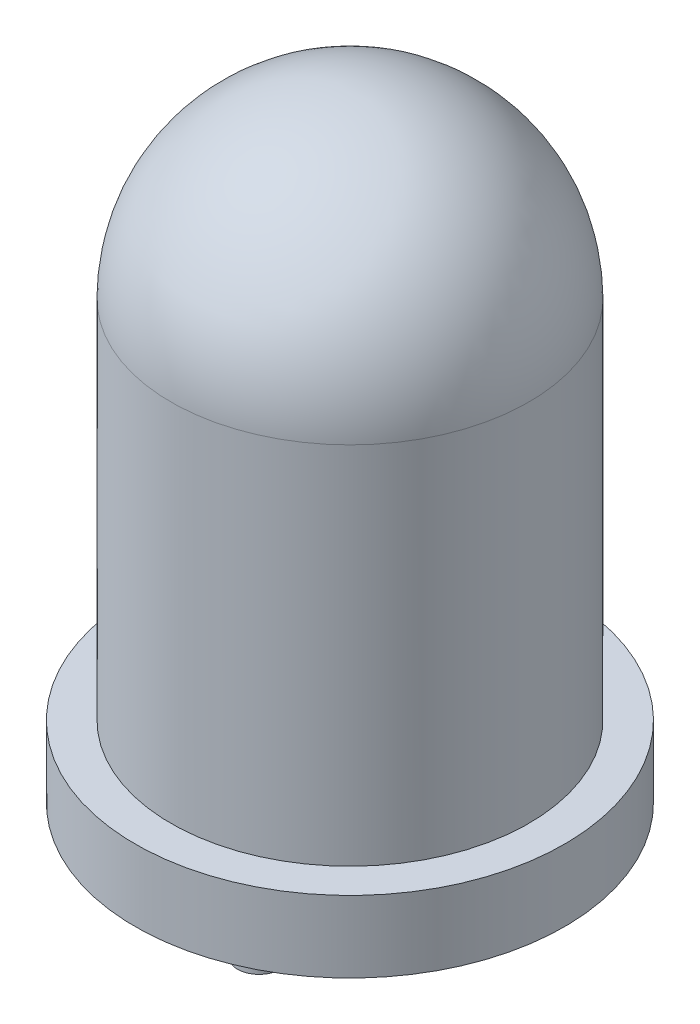
ISO-10303-21;
HEADER;
FILE_DESCRIPTION(('STEP AP214'),'2;1');
FILE_NAME('part.step','',(''),(''),'','','');
FILE_SCHEMA(('AUTOMOTIVE_DESIGN { 1 0 10303 214 1 1 1 1 }'));
ENDSEC;
DATA;
#1=APPLICATION_CONTEXT('core data for automotive mechanical design processes');
#2=APPLICATION_PROTOCOL_DEFINITION('international standard','automotive_design',2000,#1);
#3=PRODUCT_CONTEXT('',#1,'mechanical');
#4=PRODUCT('Part','Part','',(#3));
#5=PRODUCT_RELATED_PRODUCT_CATEGORY('part','',(#4));
#6=PRODUCT_DEFINITION_FORMATION('','',#4);
#7=PRODUCT_DEFINITION_CONTEXT('part definition',#1,'design');
#8=PRODUCT_DEFINITION('design','',#6,#7);
#9=PRODUCT_DEFINITION_SHAPE('','',#8);
#10=(LENGTH_UNIT() NAMED_UNIT(*) SI_UNIT(.MILLI.,.METRE.));
#11=(NAMED_UNIT(*) PLANE_ANGLE_UNIT() SI_UNIT($,.RADIAN.));
#12=(NAMED_UNIT(*) SI_UNIT($,.STERADIAN.) SOLID_ANGLE_UNIT());
#13=UNCERTAINTY_MEASURE_WITH_UNIT(LENGTH_MEASURE(1.E-05),#10,'distance_accuracy_value','');
#14=(GEOMETRIC_REPRESENTATION_CONTEXT(3) GLOBAL_UNCERTAINTY_ASSIGNED_CONTEXT((#13)) GLOBAL_UNIT_ASSIGNED_CONTEXT((#10,
#11,#12)) REPRESENTATION_CONTEXT('',''));
#15=CARTESIAN_POINT('',(0.,0.,0.));
#16=DIRECTION('',(0.,0.,1.));
#17=DIRECTION('',(1.,0.,0.));
#18=AXIS2_PLACEMENT_3D('',#15,#16,#17);
#19=CARTESIAN_POINT('',(-3.,0.,0.));
#20=DIRECTION('',(0.,1.,0.));
#21=DIRECTION('',(0.,0.,1.));
#22=AXIS2_PLACEMENT_3D('',#19,#20,#21);
#23=PLANE('',#22);
#24=CARTESIAN_POINT('',(1.27,0.,0.));
#25=DIRECTION('',(0.,1.,0.));
#26=DIRECTION('',(0.,0.,1.));
#27=AXIS2_PLACEMENT_3D('',#24,#25,#26);
#28=CIRCLE('',#27,0.3);
#29=CARTESIAN_POINT('',(1.27,0.,0.3));
#30=VERTEX_POINT('',#29);
#31=EDGE_CURVE('E303',#30,#30,#28,.F.);
#32=ORIENTED_EDGE('',*,*,#31,.F.);
#33=EDGE_LOOP('',(#32));
#34=FACE_BOUND('',#33,.T.);
#35=CARTESIAN_POINT('',(-1.27,0.,0.));
#36=DIRECTION('',(0.,1.,0.));
#37=DIRECTION('',(0.,0.,1.));
#38=AXIS2_PLACEMENT_3D('',#35,#36,#37);
#39=CIRCLE('',#38,0.3);
#40=CARTESIAN_POINT('',(-1.27,0.,0.3));
#41=VERTEX_POINT('',#40);
#42=EDGE_CURVE('E300',#41,#41,#39,.F.);
#43=ORIENTED_EDGE('',*,*,#42,.F.);
#44=EDGE_LOOP('',(#43));
#45=FACE_BOUND('',#44,.T.);
#46=CARTESIAN_POINT('',(0.,0.,0.));
#47=DIRECTION('',(0.,-1.,0.));
#48=DIRECTION('',(0.,0.,-1.));
#49=AXIS2_PLACEMENT_3D('',#46,#47,#48);
#50=CIRCLE('',#49,3.);
#51=CARTESIAN_POINT('',(0.,0.,-3.));
#52=VERTEX_POINT('',#51);
#53=EDGE_CURVE('E282',#52,#52,#50,.T.);
#54=ORIENTED_EDGE('',*,*,#53,.T.);
#55=EDGE_LOOP('',(#54));
#56=FACE_BOUND('',#55,.T.);
#57=ADVANCED_FACE('F38',(#34,#45,#56),#23,.F.);
#58=CARTESIAN_POINT('',(0.,6.1,0.));
#59=DIRECTION('',(0.,-1.,0.));
#60=DIRECTION('',(-1.,0.,0.));
#61=AXIS2_PLACEMENT_3D('',#58,#59,#60);
#62=SPHERICAL_SURFACE('',#61,2.5);
#63=CARTESIAN_POINT('',(0.,6.1,0.));
#64=DIRECTION('',(0.,-1.,0.));
#65=DIRECTION('',(0.,0.,-1.));
#66=AXIS2_PLACEMENT_3D('',#63,#64,#65);
#67=CIRCLE('',#66,2.5);
#68=CARTESIAN_POINT('',(0.,6.1,-2.5));
#69=VERTEX_POINT('',#68);
#70=EDGE_CURVE('E291',#69,#69,#67,.T.);
#71=ORIENTED_EDGE('',*,*,#70,.F.);
#72=EDGE_LOOP('',(#71));
#73=FACE_BOUND('',#72,.T.);
#74=ADVANCED_FACE('F382',(#73),#62,.T.);
#75=CARTESIAN_POINT('',(0.,0.,0.));
#76=DIRECTION('',(0.,-1.,0.));
#77=DIRECTION('',(0.,0.,-1.));
#78=AXIS2_PLACEMENT_3D('',#75,#76,#77);
#79=CYLINDRICAL_SURFACE('',#78,2.5);
#80=CARTESIAN_POINT('',(0.,1.,0.));
#81=DIRECTION('',(0.,-1.,0.));
#82=DIRECTION('',(0.,0.,-1.));
#83=AXIS2_PLACEMENT_3D('',#80,#81,#82);
#84=CIRCLE('',#83,2.5);
#85=CARTESIAN_POINT('',(0.,1.,-2.5));
#86=VERTEX_POINT('',#85);
#87=EDGE_CURVE('E288',#86,#86,#84,.T.);
#88=ORIENTED_EDGE('',*,*,#87,.F.);
#89=EDGE_LOOP('',(#88));
#90=FACE_BOUND('',#89,.T.);
#91=ORIENTED_EDGE('',*,*,#70,.T.);
#92=EDGE_LOOP('',(#91));
#93=FACE_BOUND('',#92,.T.);
#94=ADVANCED_FACE('F385',(#90,#93),#79,.T.);
#95=CARTESIAN_POINT('',(-2.5,1.,0.));
#96=DIRECTION('',(0.,-1.,0.));
#97=DIRECTION('',(0.,0.,-1.));
#98=AXIS2_PLACEMENT_3D('',#95,#96,#97);
#99=PLANE('',#98);
#100=CARTESIAN_POINT('',(0.,1.,0.));
#101=DIRECTION('',(0.,-1.,0.));
#102=DIRECTION('',(0.,0.,-1.));
#103=AXIS2_PLACEMENT_3D('',#100,#101,#102);
#104=CIRCLE('',#103,3.);
#105=CARTESIAN_POINT('',(0.,1.,-3.));
#106=VERTEX_POINT('',#105);
#107=EDGE_CURVE('E285',#106,#106,#104,.T.);
#108=ORIENTED_EDGE('',*,*,#107,.F.);
#109=EDGE_LOOP('',(#108));
#110=FACE_BOUND('',#109,.T.);
#111=ORIENTED_EDGE('',*,*,#87,.T.);
#112=EDGE_LOOP('',(#111));
#113=FACE_BOUND('',#112,.T.);
#114=ADVANCED_FACE('F389',(#110,#113),#99,.F.);
#115=CARTESIAN_POINT('',(0.,0.,0.));
#116=DIRECTION('',(0.,-1.,0.));
#117=DIRECTION('',(0.,0.,-1.));
#118=AXIS2_PLACEMENT_3D('',#115,#116,#117);
#119=CYLINDRICAL_SURFACE('',#118,3.);
#120=ORIENTED_EDGE('',*,*,#53,.F.);
#121=EDGE_LOOP('',(#120));
#122=FACE_BOUND('',#121,.T.);
#123=ORIENTED_EDGE('',*,*,#107,.T.);
#124=EDGE_LOOP('',(#123));
#125=FACE_BOUND('',#124,.T.);
#126=ADVANCED_FACE('F393',(#122,#125),#119,.T.);
#127=CARTESIAN_POINT('',(-1.27,-2.5,0.));
#128=DIRECTION('',(0.,1.,0.));
#129=DIRECTION('',(0.,0.,1.));
#130=AXIS2_PLACEMENT_3D('',#127,#128,#129);
#131=CYLINDRICAL_SURFACE('',#130,0.3);
#132=CARTESIAN_POINT('',(-1.27,-2.5,0.));
#133=DIRECTION('',(0.,-1.,0.));
#134=DIRECTION('',(0.,0.,-1.));
#135=AXIS2_PLACEMENT_3D('',#132,#133,#134);
#136=CIRCLE('',#135,0.3);
#137=CARTESIAN_POINT('',(-1.27,-2.5,-0.3));
#138=VERTEX_POINT('',#137);
#139=EDGE_CURVE('E279',#138,#138,#136,.T.);
#140=ORIENTED_EDGE('',*,*,#139,.F.);
#141=EDGE_LOOP('',(#140));
#142=FACE_BOUND('',#141,.T.);
#143=ORIENTED_EDGE('',*,*,#42,.T.);
#144=EDGE_LOOP('',(#143));
#145=FACE_BOUND('',#144,.T.);
#146=ADVANCED_FACE('F397',(#142,#145),#131,.T.);
#147=CARTESIAN_POINT('',(-1.27,-2.5,0.));
#148=DIRECTION('',(0.,-1.,0.));
#149=DIRECTION('',(0.,0.,-1.));
#150=AXIS2_PLACEMENT_3D('',#147,#148,#149);
#151=PLANE('',#150);
#152=ORIENTED_EDGE('',*,*,#139,.T.);
#153=EDGE_LOOP('',(#152));
#154=FACE_BOUND('',#153,.T.);
#155=ADVANCED_FACE('F404',(#154),#151,.T.);
#156=CARTESIAN_POINT('',(1.27,-1.,0.));
#157=DIRECTION('',(0.,1.,0.));
#158=DIRECTION('',(0.,0.,1.));
#159=AXIS2_PLACEMENT_3D('',#156,#157,#158);
#160=CYLINDRICAL_SURFACE('',#159,0.3);
#161=CARTESIAN_POINT('',(1.27,-1.,0.));
#162=DIRECTION('',(0.,-1.,0.));
#163=DIRECTION('',(0.,0.,-1.));
#164=AXIS2_PLACEMENT_3D('',#161,#162,#163);
#165=CIRCLE('',#164,0.3);
#166=CARTESIAN_POINT('',(1.27,-1.,-0.3));
#167=VERTEX_POINT('',#166);
#168=EDGE_CURVE('E276',#167,#167,#165,.T.);
#169=ORIENTED_EDGE('',*,*,#168,.F.);
#170=EDGE_LOOP('',(#169));
#171=FACE_BOUND('',#170,.T.);
#172=ORIENTED_EDGE('',*,*,#31,.T.);
#173=EDGE_LOOP('',(#172));
#174=FACE_BOUND('',#173,.T.);
#175=ADVANCED_FACE('F408',(#171,#174),#160,.T.);
#176=CARTESIAN_POINT('',(1.27,-1.,0.));
#177=DIRECTION('',(0.,-1.,0.));
#178=DIRECTION('',(0.,0.,-1.));
#179=AXIS2_PLACEMENT_3D('',#176,#177,#178);
#180=PLANE('',#179);
#181=ORIENTED_EDGE('',*,*,#168,.T.);
#182=EDGE_LOOP('',(#181));
#183=FACE_BOUND('',#182,.T.);
#184=ADVANCED_FACE('F412',(#183),#180,.T.);
#185=CLOSED_SHELL('',(#57,#74,#94,#114,#126,#146,#155,#175,#184));
#186=CARTESIAN_POINT('',(-2.2,0.5,0.));
#187=DIRECTION('',(0.,-1.,0.));
#188=DIRECTION('',(0.,0.,-1.));
#189=AXIS2_PLACEMENT_3D('',#186,#187,#188);
#190=PLANE('',#189);
#191=DIRECTION('',(0.,0.,-1.));
#192=VECTOR('',#191,1.);
#193=CARTESIAN_POINT('',(1.62,0.5,0.));
#194=LINE('',#193,#192);
#195=CARTESIAN_POINT('',(1.62,0.5,0.25));
#196=VERTEX_POINT('',#195);
#197=CARTESIAN_POINT('',(1.62,0.5,-0.25));
#198=VERTEX_POINT('',#197);
#199=EDGE_CURVE('E320',#196,#198,#194,.T.);
#200=ORIENTED_EDGE('',*,*,#199,.F.);
#201=DIRECTION('',(-1.,0.,0.));
#202=VECTOR('',#201,1.);
#203=CARTESIAN_POINT('',(-2.2,0.5,0.25));
#204=LINE('',#203,#202);
#205=CARTESIAN_POINT('',(0.92,0.5,0.25));
#206=VERTEX_POINT('',#205);
#207=EDGE_CURVE('E47',#196,#206,#204,.T.);
#208=ORIENTED_EDGE('',*,*,#207,.T.);
#209=DIRECTION('',(0.,0.,1.));
#210=VECTOR('',#209,1.);
#211=CARTESIAN_POINT('',(0.92,0.5,0.));
#212=LINE('',#211,#210);
#213=CARTESIAN_POINT('',(0.92,0.5,-0.25));
#214=VERTEX_POINT('',#213);
#215=EDGE_CURVE('E323',#214,#206,#212,.T.);
#216=ORIENTED_EDGE('',*,*,#215,.F.);
#217=DIRECTION('',(-1.,0.,0.));
#218=VECTOR('',#217,1.);
#219=CARTESIAN_POINT('',(-2.2,0.5,-0.25));
#220=LINE('',#219,#218);
#221=EDGE_CURVE('E317',#198,#214,#220,.T.);
#222=ORIENTED_EDGE('',*,*,#221,.F.);
#223=EDGE_LOOP('',(#200,#208,#216,#222));
#224=FACE_BOUND('',#223,.T.);
#225=DIRECTION('',(0.,0.,-1.));
#226=VECTOR('',#225,1.);
#227=CARTESIAN_POINT('',(-0.92,0.5,0.));
#228=LINE('',#227,#226);
#229=CARTESIAN_POINT('',(-0.92,0.5,0.25));
#230=VERTEX_POINT('',#229);
#231=CARTESIAN_POINT('',(-0.92,0.5,-0.25));
#232=VERTEX_POINT('',#231);
#233=EDGE_CURVE('E309',#230,#232,#228,.T.);
#234=ORIENTED_EDGE('',*,*,#233,.F.);
#235=DIRECTION('',(-1.,0.,0.));
#236=VECTOR('',#235,1.);
#237=CARTESIAN_POINT('',(-2.2,0.5,0.25));
#238=LINE('',#237,#236);
#239=CARTESIAN_POINT('',(-1.62,0.5,0.25));
#240=VERTEX_POINT('',#239);
#241=EDGE_CURVE('E315',#230,#240,#238,.T.);
#242=ORIENTED_EDGE('',*,*,#241,.T.);
#243=DIRECTION('',(0.,0.,1.));
#244=VECTOR('',#243,1.);
#245=CARTESIAN_POINT('',(-1.62,0.5,0.));
#246=LINE('',#245,#244);
#247=CARTESIAN_POINT('',(-1.62,0.5,-0.25));
#248=VERTEX_POINT('',#247);
#249=EDGE_CURVE('E312',#248,#240,#246,.T.);
#250=ORIENTED_EDGE('',*,*,#249,.F.);
#251=DIRECTION('',(-1.,0.,0.));
#252=VECTOR('',#251,1.);
#253=CARTESIAN_POINT('',(-2.2,0.5,-0.25));
#254=LINE('',#253,#252);
#255=EDGE_CURVE('E306',#232,#248,#254,.T.);
#256=ORIENTED_EDGE('',*,*,#255,.F.);
#257=EDGE_LOOP('',(#234,#242,#250,#256));
#258=FACE_BOUND('',#257,.T.);
#259=CARTESIAN_POINT('',(0.,0.5,0.));
#260=DIRECTION('',(0.,-1.,0.));
#261=DIRECTION('',(0.,0.,-1.));
#262=AXIS2_PLACEMENT_3D('',#259,#260,#261);
#263=CIRCLE('',#262,2.2);
#264=CARTESIAN_POINT('',(0.,0.5,-2.2));
#265=VERTEX_POINT('',#264);
#266=EDGE_CURVE('E297',#265,#265,#263,.T.);
#267=ORIENTED_EDGE('',*,*,#266,.F.);
#268=EDGE_LOOP('',(#267));
#269=FACE_BOUND('',#268,.T.);
#270=ADVANCED_FACE('F40',(#224,#258,#269),#190,.F.);
#271=CARTESIAN_POINT('',(0.,0.,0.));
#272=DIRECTION('',(0.,-1.,0.));
#273=DIRECTION('',(0.,0.,-1.));
#274=AXIS2_PLACEMENT_3D('',#271,#272,#273);
#275=CYLINDRICAL_SURFACE('',#274,2.2);
#276=CARTESIAN_POINT('',(0.,6.1,0.));
#277=DIRECTION('',(0.,-1.,0.));
#278=DIRECTION('',(0.,0.,-1.));
#279=AXIS2_PLACEMENT_3D('',#276,#277,#278);
#280=CIRCLE('',#279,2.2);
#281=CARTESIAN_POINT('',(0.,6.1,-2.2));
#282=VERTEX_POINT('',#281);
#283=EDGE_CURVE('E294',#282,#282,#280,.T.);
#284=ORIENTED_EDGE('',*,*,#283,.F.);
#285=EDGE_LOOP('',(#284));
#286=FACE_BOUND('',#285,.T.);
#287=ORIENTED_EDGE('',*,*,#266,.T.);
#288=EDGE_LOOP('',(#287));
#289=FACE_BOUND('',#288,.T.);
#290=ADVANCED_FACE('F366',(#286,#289),#275,.F.);
#291=CARTESIAN_POINT('',(0.,6.1,0.));
#292=DIRECTION('',(0.,-1.,0.));
#293=DIRECTION('',(-1.,0.,0.));
#294=AXIS2_PLACEMENT_3D('',#291,#292,#293);
#295=SPHERICAL_SURFACE('',#294,2.2);
#296=ORIENTED_EDGE('',*,*,#283,.T.);
#297=EDGE_LOOP('',(#296));
#298=FACE_BOUND('',#297,.T.);
#299=ADVANCED_FACE('F371',(#298),#295,.F.);
#300=CARTESIAN_POINT('',(-1.62,4.2,0.25));
#301=DIRECTION('',(1.,0.,0.));
#302=DIRECTION('',(0.,1.,0.));
#303=AXIS2_PLACEMENT_3D('',#300,#301,#302);
#304=PLANE('',#303);
#305=DIRECTION('',(0.,-1.,0.));
#306=VECTOR('',#305,1.);
#307=CARTESIAN_POINT('',(-1.62,4.2,-0.25));
#308=LINE('',#307,#306);
#309=CARTESIAN_POINT('',(-1.62,4.2,-0.25));
#310=VERTEX_POINT('',#309);
#311=EDGE_CURVE('E228',#310,#248,#308,.T.);
#312=ORIENTED_EDGE('',*,*,#311,.T.);
#313=ORIENTED_EDGE('',*,*,#249,.T.);
#314=DIRECTION('',(0.,-1.,0.));
#315=VECTOR('',#314,1.);
#316=CARTESIAN_POINT('',(-1.62,4.2,0.25));
#317=LINE('',#316,#315);
#318=CARTESIAN_POINT('',(-1.62,4.2,0.25));
#319=VERTEX_POINT('',#318);
#320=EDGE_CURVE('E229',#319,#240,#317,.T.);
#321=ORIENTED_EDGE('',*,*,#320,.F.);
#322=DIRECTION('',(0.,0.,-1.));
#323=VECTOR('',#322,1.);
#324=CARTESIAN_POINT('',(-1.62,4.2,0.25));
#325=LINE('',#324,#323);
#326=EDGE_CURVE('E245',#319,#310,#325,.T.);
#327=ORIENTED_EDGE('',*,*,#326,.T.);
#328=EDGE_LOOP('',(#312,#313,#321,#327));
#329=FACE_BOUND('',#328,.T.);
#330=ADVANCED_FACE('F376',(#329),#304,.F.);
#331=CARTESIAN_POINT('',(-0.920000000000001,2.2,0.25));
#332=DIRECTION('',(-1.,0.,0.));
#333=DIRECTION('',(0.,-1.,0.));
#334=AXIS2_PLACEMENT_3D('',#331,#332,#333);
#335=PLANE('',#334);
#336=DIRECTION('',(0.,1.,0.));
#337=VECTOR('',#336,1.);
#338=CARTESIAN_POINT('',(-0.920000000000001,2.2,0.25));
#339=LINE('',#338,#337);
#340=CARTESIAN_POINT('',(-0.920000000000001,2.2,0.25));
#341=VERTEX_POINT('',#340);
#342=EDGE_CURVE('E232',#230,#341,#339,.T.);
#343=ORIENTED_EDGE('',*,*,#342,.F.);
#344=ORIENTED_EDGE('',*,*,#233,.T.);
#345=DIRECTION('',(0.,1.,0.));
#346=VECTOR('',#345,1.);
#347=CARTESIAN_POINT('',(-0.920000000000001,2.2,-0.25));
#348=LINE('',#347,#346);
#349=CARTESIAN_POINT('',(-0.920000000000001,2.2,-0.25));
#350=VERTEX_POINT('',#349);
#351=EDGE_CURVE('E248',#232,#350,#348,.T.);
#352=ORIENTED_EDGE('',*,*,#351,.T.);
#353=DIRECTION('',(0.,0.,-1.));
#354=VECTOR('',#353,1.);
#355=CARTESIAN_POINT('',(-0.920000000000001,2.2,0.25));
#356=LINE('',#355,#354);
#357=EDGE_CURVE('E273',#341,#350,#356,.T.);
#358=ORIENTED_EDGE('',*,*,#357,.F.);
#359=EDGE_LOOP('',(#343,#344,#352,#358));
#360=FACE_BOUND('',#359,.T.);
#361=ADVANCED_FACE('F418',(#360),#335,.F.);
#362=CARTESIAN_POINT('',(0.,0.,0.25));
#363=DIRECTION('',(0.,0.,1.));
#364=DIRECTION('',(1.,0.,0.));
#365=AXIS2_PLACEMENT_3D('',#362,#363,#364);
#366=PLANE('',#365);
#367=ORIENTED_EDGE('',*,*,#241,.F.);
#368=ORIENTED_EDGE('',*,*,#342,.T.);
#369=DIRECTION('',(1.,0.,0.));
#370=VECTOR('',#369,1.);
#371=CARTESIAN_POINT('',(0.320000000000001,2.2,0.25));
#372=LINE('',#371,#370);
#373=CARTESIAN_POINT('',(0.320000000000001,2.2,0.25));
#374=VERTEX_POINT('',#373);
#375=EDGE_CURVE('E235',#341,#374,#372,.T.);
#376=ORIENTED_EDGE('',*,*,#375,.T.);
#377=DIRECTION('',(0.,1.,0.));
#378=VECTOR('',#377,1.);
#379=CARTESIAN_POINT('',(0.320000000000001,2.8,0.25));
#380=LINE('',#379,#378);
#381=CARTESIAN_POINT('',(0.320000000000001,2.8,0.25));
#382=VERTEX_POINT('',#381);
#383=EDGE_CURVE('E237',#374,#382,#380,.T.);
#384=ORIENTED_EDGE('',*,*,#383,.T.);
#385=DIRECTION('',(-1.,0.,0.));
#386=VECTOR('',#385,1.);
#387=CARTESIAN_POINT('',(-0.610441672027316,2.8,0.25));
#388=LINE('',#387,#386);
#389=CARTESIAN_POINT('',(-0.610441672027316,2.8,0.25));
#390=VERTEX_POINT('',#389);
#391=EDGE_CURVE('E239',#382,#390,#388,.T.);
#392=ORIENTED_EDGE('',*,*,#391,.T.);
#393=DIRECTION('',(-0.342020143325669,0.939692620785908,0.));
#394=VECTOR('',#393,1.);
#395=CARTESIAN_POINT('',(-1.12,4.2,0.25));
#396=LINE('',#395,#394);
#397=CARTESIAN_POINT('',(-1.12,4.2,0.25));
#398=VERTEX_POINT('',#397);
#399=EDGE_CURVE('E241',#390,#398,#396,.T.);
#400=ORIENTED_EDGE('',*,*,#399,.T.);
#401=DIRECTION('',(-1.,0.,0.));
#402=VECTOR('',#401,1.);
#403=CARTESIAN_POINT('',(-1.62,4.2,0.25));
#404=LINE('',#403,#402);
#405=EDGE_CURVE('E243',#398,#319,#404,.T.);
#406=ORIENTED_EDGE('',*,*,#405,.T.);
#407=ORIENTED_EDGE('',*,*,#320,.T.);
#408=EDGE_LOOP('',(#367,#368,#376,#384,#392,#400,#406,#407));
#409=FACE_BOUND('',#408,.T.);
#410=ADVANCED_FACE('F422',(#409),#366,.T.);
#411=CARTESIAN_POINT('',(0.,0.,-0.25));
#412=DIRECTION('',(0.,0.,1.));
#413=DIRECTION('',(1.,0.,0.));
#414=AXIS2_PLACEMENT_3D('',#411,#412,#413);
#415=PLANE('',#414);
#416=ORIENTED_EDGE('',*,*,#351,.F.);
#417=ORIENTED_EDGE('',*,*,#255,.T.);
#418=ORIENTED_EDGE('',*,*,#311,.F.);
#419=DIRECTION('',(-1.,0.,0.));
#420=VECTOR('',#419,1.);
#421=CARTESIAN_POINT('',(-1.62,4.2,-0.25));
#422=LINE('',#421,#420);
#423=CARTESIAN_POINT('',(-1.12,4.2,-0.25));
#424=VERTEX_POINT('',#423);
#425=EDGE_CURVE('E233',#424,#310,#422,.T.);
#426=ORIENTED_EDGE('',*,*,#425,.F.);
#427=DIRECTION('',(-0.342020143325669,0.939692620785908,0.));
#428=VECTOR('',#427,1.);
#429=CARTESIAN_POINT('',(-1.12,4.2,-0.25));
#430=LINE('',#429,#428);
#431=CARTESIAN_POINT('',(-0.610441672027316,2.8,-0.25));
#432=VERTEX_POINT('',#431);
#433=EDGE_CURVE('E256',#432,#424,#430,.T.);
#434=ORIENTED_EDGE('',*,*,#433,.F.);
#435=DIRECTION('',(-1.,0.,0.));
#436=VECTOR('',#435,1.);
#437=CARTESIAN_POINT('',(-0.610441672027316,2.8,-0.25));
#438=LINE('',#437,#436);
#439=CARTESIAN_POINT('',(0.320000000000001,2.8,-0.25));
#440=VERTEX_POINT('',#439);
#441=EDGE_CURVE('E254',#440,#432,#438,.T.);
#442=ORIENTED_EDGE('',*,*,#441,.F.);
#443=DIRECTION('',(0.,1.,0.));
#444=VECTOR('',#443,1.);
#445=CARTESIAN_POINT('',(0.320000000000001,2.8,-0.25));
#446=LINE('',#445,#444);
#447=CARTESIAN_POINT('',(0.320000000000001,2.2,-0.25));
#448=VERTEX_POINT('',#447);
#449=EDGE_CURVE('E252',#448,#440,#446,.T.);
#450=ORIENTED_EDGE('',*,*,#449,.F.);
#451=DIRECTION('',(1.,0.,0.));
#452=VECTOR('',#451,1.);
#453=CARTESIAN_POINT('',(0.320000000000001,2.2,-0.25));
#454=LINE('',#453,#452);
#455=EDGE_CURVE('E250',#350,#448,#454,.T.);
#456=ORIENTED_EDGE('',*,*,#455,.F.);
#457=EDGE_LOOP('',(#416,#417,#418,#426,#434,#442,#450,#456));
#458=FACE_BOUND('',#457,.T.);
#459=ADVANCED_FACE('F428',(#458),#415,.F.);
#460=CARTESIAN_POINT('',(0.320000000000001,2.2,0.25));
#461=DIRECTION('',(0.,1.,0.));
#462=DIRECTION('',(0.,0.,1.));
#463=AXIS2_PLACEMENT_3D('',#460,#461,#462);
#464=PLANE('',#463);
#465=ORIENTED_EDGE('',*,*,#455,.T.);
#466=DIRECTION('',(0.,0.,-1.));
#467=VECTOR('',#466,1.);
#468=CARTESIAN_POINT('',(0.320000000000001,2.2,0.25));
#469=LINE('',#468,#467);
#470=EDGE_CURVE('E270',#374,#448,#469,.T.);
#471=ORIENTED_EDGE('',*,*,#470,.F.);
#472=ORIENTED_EDGE('',*,*,#375,.F.);
#473=ORIENTED_EDGE('',*,*,#357,.T.);
#474=EDGE_LOOP('',(#465,#471,#472,#473));
#475=FACE_BOUND('',#474,.T.);
#476=ADVANCED_FACE('F424',(#475),#464,.F.);
#477=CARTESIAN_POINT('',(0.320000000000001,2.8,0.25));
#478=DIRECTION('',(-1.,0.,0.));
#479=DIRECTION('',(0.,-1.,0.));
#480=AXIS2_PLACEMENT_3D('',#477,#478,#479);
#481=PLANE('',#480);
#482=ORIENTED_EDGE('',*,*,#449,.T.);
#483=DIRECTION('',(0.,0.,-1.));
#484=VECTOR('',#483,1.);
#485=CARTESIAN_POINT('',(0.320000000000001,2.8,0.25));
#486=LINE('',#485,#484);
#487=EDGE_CURVE('E267',#382,#440,#486,.T.);
#488=ORIENTED_EDGE('',*,*,#487,.F.);
#489=ORIENTED_EDGE('',*,*,#383,.F.);
#490=ORIENTED_EDGE('',*,*,#470,.T.);
#491=EDGE_LOOP('',(#482,#488,#489,#490));
#492=FACE_BOUND('',#491,.T.);
#493=ADVANCED_FACE('F427',(#492),#481,.F.);
#494=CARTESIAN_POINT('',(-0.610441672027316,2.8,0.25));
#495=DIRECTION('',(0.,-1.,0.));
#496=DIRECTION('',(0.,0.,-1.));
#497=AXIS2_PLACEMENT_3D('',#494,#495,#496);
#498=PLANE('',#497);
#499=ORIENTED_EDGE('',*,*,#441,.T.);
#500=DIRECTION('',(0.,0.,-1.));
#501=VECTOR('',#500,1.);
#502=CARTESIAN_POINT('',(-0.610441672027316,2.8,0.25));
#503=LINE('',#502,#501);
#504=EDGE_CURVE('E264',#390,#432,#503,.T.);
#505=ORIENTED_EDGE('',*,*,#504,.F.);
#506=ORIENTED_EDGE('',*,*,#391,.F.);
#507=ORIENTED_EDGE('',*,*,#487,.T.);
#508=EDGE_LOOP('',(#499,#505,#506,#507));
#509=FACE_BOUND('',#508,.T.);
#510=ADVANCED_FACE('F432',(#509),#498,.F.);
#511=CARTESIAN_POINT('',(-1.12,4.2,0.25));
#512=DIRECTION('',(-0.939692620785908,-0.34202014332567,0.));
#513=DIRECTION('',(0.34202014332567,-0.939692620785908,0.));
#514=AXIS2_PLACEMENT_3D('',#511,#512,#513);
#515=PLANE('',#514);
#516=ORIENTED_EDGE('',*,*,#433,.T.);
#517=DIRECTION('',(0.,0.,-1.));
#518=VECTOR('',#517,1.);
#519=CARTESIAN_POINT('',(-1.12,4.2,0.25));
#520=LINE('',#519,#518);
#521=EDGE_CURVE('E261',#398,#424,#520,.T.);
#522=ORIENTED_EDGE('',*,*,#521,.F.);
#523=ORIENTED_EDGE('',*,*,#399,.F.);
#524=ORIENTED_EDGE('',*,*,#504,.T.);
#525=EDGE_LOOP('',(#516,#522,#523,#524));
#526=FACE_BOUND('',#525,.T.);
#527=ADVANCED_FACE('F436',(#526),#515,.F.);
#528=CARTESIAN_POINT('',(-1.62,4.2,0.25));
#529=DIRECTION('',(0.,-1.,0.));
#530=DIRECTION('',(0.,0.,-1.));
#531=AXIS2_PLACEMENT_3D('',#528,#529,#530);
#532=PLANE('',#531);
#533=ORIENTED_EDGE('',*,*,#425,.T.);
#534=ORIENTED_EDGE('',*,*,#326,.F.);
#535=ORIENTED_EDGE('',*,*,#405,.F.);
#536=ORIENTED_EDGE('',*,*,#521,.T.);
#537=EDGE_LOOP('',(#533,#534,#535,#536));
#538=FACE_BOUND('',#537,.T.);
#539=ADVANCED_FACE('F440',(#538),#532,.F.);
#540=CARTESIAN_POINT('',(0.92,0.,0.25));
#541=DIRECTION('',(1.,0.,0.));
#542=DIRECTION('',(0.,1.,0.));
#543=AXIS2_PLACEMENT_3D('',#540,#541,#542);
#544=PLANE('',#543);
#545=DIRECTION('',(0.,-1.,0.));
#546=VECTOR('',#545,1.);
#547=CARTESIAN_POINT('',(0.92,0.,-0.25));
#548=LINE('',#547,#546);
#549=CARTESIAN_POINT('',(0.920000000000001,3.2,-0.25));
#550=VERTEX_POINT('',#549);
#551=EDGE_CURVE('E211',#550,#214,#548,.T.);
#552=ORIENTED_EDGE('',*,*,#551,.T.);
#553=ORIENTED_EDGE('',*,*,#215,.T.);
#554=DIRECTION('',(0.,-1.,0.));
#555=VECTOR('',#554,1.);
#556=CARTESIAN_POINT('',(0.92,0.,0.25));
#557=LINE('',#556,#555);
#558=CARTESIAN_POINT('',(0.920000000000001,3.2,0.25));
#559=VERTEX_POINT('',#558);
#560=EDGE_CURVE('E198',#559,#206,#557,.T.);
#561=ORIENTED_EDGE('',*,*,#560,.F.);
#562=DIRECTION('',(0.,0.,-1.));
#563=VECTOR('',#562,1.);
#564=CARTESIAN_POINT('',(0.920000000000001,3.2,0.25));
#565=LINE('',#564,#563);
#566=EDGE_CURVE('E222',#559,#550,#565,.T.);
#567=ORIENTED_EDGE('',*,*,#566,.T.);
#568=EDGE_LOOP('',(#552,#553,#561,#567));
#569=FACE_BOUND('',#568,.T.);
#570=ADVANCED_FACE('F331',(#569),#544,.F.);
#571=CARTESIAN_POINT('',(1.62,4.2,0.25));
#572=DIRECTION('',(-1.,0.,0.));
#573=DIRECTION('',(0.,-1.,0.));
#574=AXIS2_PLACEMENT_3D('',#571,#572,#573);
#575=PLANE('',#574);
#576=DIRECTION('',(0.,1.,0.));
#577=VECTOR('',#576,1.);
#578=CARTESIAN_POINT('',(1.62,4.2,0.25));
#579=LINE('',#578,#577);
#580=CARTESIAN_POINT('',(1.62,4.2,0.25));
#581=VERTEX_POINT('',#580);
#582=EDGE_CURVE('E201',#196,#581,#579,.T.);
#583=ORIENTED_EDGE('',*,*,#582,.F.);
#584=ORIENTED_EDGE('',*,*,#199,.T.);
#585=DIRECTION('',(0.,1.,0.));
#586=VECTOR('',#585,1.);
#587=CARTESIAN_POINT('',(1.62,4.2,-0.25));
#588=LINE('',#587,#586);
#589=CARTESIAN_POINT('',(1.62,4.2,-0.25));
#590=VERTEX_POINT('',#589);
#591=EDGE_CURVE('E214',#198,#590,#588,.T.);
#592=ORIENTED_EDGE('',*,*,#591,.T.);
#593=DIRECTION('',(0.,0.,-1.));
#594=VECTOR('',#593,1.);
#595=CARTESIAN_POINT('',(1.62,4.2,0.25));
#596=LINE('',#595,#594);
#597=EDGE_CURVE('E219',#581,#590,#596,.T.);
#598=ORIENTED_EDGE('',*,*,#597,.F.);
#599=EDGE_LOOP('',(#583,#584,#592,#598));
#600=FACE_BOUND('',#599,.T.);
#601=ADVANCED_FACE('F341',(#600),#575,.F.);
#602=CARTESIAN_POINT('',(0.,0.,0.25));
#603=DIRECTION('',(0.,0.,1.));
#604=DIRECTION('',(1.,0.,0.));
#605=AXIS2_PLACEMENT_3D('',#602,#603,#604);
#606=PLANE('',#605);
#607=DIRECTION('',(0.,1.,0.));
#608=VECTOR('',#607,1.);
#609=CARTESIAN_POINT('',(0.545435605731786,4.,0.25));
#610=LINE('',#609,#608);
#611=CARTESIAN_POINT('',(0.545435605731786,4.,0.25));
#612=VERTEX_POINT('',#611);
#613=CARTESIAN_POINT('',(0.545435605731786,4.2,0.25));
#614=VERTEX_POINT('',#613);
#615=EDGE_CURVE('E59',#612,#614,#610,.T.);
#616=ORIENTED_EDGE('',*,*,#615,.F.);
#617=DIRECTION('',(-1.,0.,0.));
#618=VECTOR('',#617,1.);
#619=CARTESIAN_POINT('',(0.,4.,0.25));
#620=LINE('',#619,#618);
#621=CARTESIAN_POINT('',(-0.545435605731786,4.,0.25));
#622=VERTEX_POINT('',#621);
#623=EDGE_CURVE('E54',#612,#622,#620,.T.);
#624=ORIENTED_EDGE('',*,*,#623,.T.);
#625=DIRECTION('',(0.,1.,0.));
#626=VECTOR('',#625,1.);
#627=CARTESIAN_POINT('',(-0.545435605731786,4.,0.25));
#628=LINE('',#627,#626);
#629=CARTESIAN_POINT('',(-0.545435605731786,4.2,0.25));
#630=VERTEX_POINT('',#629);
#631=EDGE_CURVE('E173',#630,#622,#628,.F.);
#632=ORIENTED_EDGE('',*,*,#631,.F.);
#633=DIRECTION('',(-1.,0.,0.));
#634=VECTOR('',#633,1.);
#635=CARTESIAN_POINT('',(-0.694328891009635,4.2,0.25));
#636=LINE('',#635,#634);
#637=CARTESIAN_POINT('',(-0.694328891009635,4.2,0.25));
#638=VERTEX_POINT('',#637);
#639=EDGE_CURVE('E203',#630,#638,#636,.T.);
#640=ORIENTED_EDGE('',*,*,#639,.T.);
#641=DIRECTION('',(0.342020143325669,-0.939692620785908,0.));
#642=VECTOR('',#641,1.);
#643=CARTESIAN_POINT('',(-0.694328891009635,4.2,0.25));
#644=LINE('',#643,#642);
#645=CARTESIAN_POINT('',(-0.330358656743432,3.2,0.25));
#646=VERTEX_POINT('',#645);
#647=EDGE_CURVE('E192',#638,#646,#644,.T.);
#648=ORIENTED_EDGE('',*,*,#647,.T.);
#649=DIRECTION('',(1.,0.,0.));
#650=VECTOR('',#649,1.);
#651=CARTESIAN_POINT('',(-0.330358656743432,3.2,0.25));
#652=LINE('',#651,#650);
#653=EDGE_CURVE('E195',#646,#559,#652,.T.);
#654=ORIENTED_EDGE('',*,*,#653,.T.);
#655=ORIENTED_EDGE('',*,*,#560,.T.);
#656=ORIENTED_EDGE('',*,*,#207,.F.);
#657=ORIENTED_EDGE('',*,*,#582,.T.);
#658=EDGE_CURVE('E204',#581,#614,#636,.T.);
#659=ORIENTED_EDGE('',*,*,#658,.T.);
#660=EDGE_LOOP('',(#616,#624,#632,#640,#648,#654,#655,#656,#657,#659));
#661=FACE_BOUND('',#660,.T.);
#662=ADVANCED_FACE('F333',(#661),#606,.T.);
#663=CARTESIAN_POINT('',(0.,0.,-0.25));
#664=DIRECTION('',(0.,0.,1.));
#665=DIRECTION('',(1.,0.,0.));
#666=AXIS2_PLACEMENT_3D('',#663,#664,#665);
#667=PLANE('',#666);
#668=DIRECTION('',(-1.,0.,0.));
#669=VECTOR('',#668,1.);
#670=CARTESIAN_POINT('',(0.,4.,-0.25));
#671=LINE('',#670,#669);
#672=CARTESIAN_POINT('',(0.545435605731786,4.,-0.25));
#673=VERTEX_POINT('',#672);
#674=CARTESIAN_POINT('',(-0.545435605731786,4.,-0.25));
#675=VERTEX_POINT('',#674);
#676=EDGE_CURVE('E11',#673,#675,#671,.T.);
#677=ORIENTED_EDGE('',*,*,#676,.F.);
#678=DIRECTION('',(0.,1.,0.));
#679=VECTOR('',#678,1.);
#680=CARTESIAN_POINT('',(0.545435605731786,4.,-0.25));
#681=LINE('',#680,#679);
#682=CARTESIAN_POINT('',(0.545435605731786,4.2,-0.25));
#683=VERTEX_POINT('',#682);
#684=EDGE_CURVE('E162',#673,#683,#681,.T.);
#685=ORIENTED_EDGE('',*,*,#684,.T.);
#686=DIRECTION('',(-1.,0.,0.));
#687=VECTOR('',#686,1.);
#688=CARTESIAN_POINT('',(-0.694328891009635,4.2,-0.25));
#689=LINE('',#688,#687);
#690=EDGE_CURVE('E196',#590,#683,#689,.T.);
#691=ORIENTED_EDGE('',*,*,#690,.F.);
#692=ORIENTED_EDGE('',*,*,#591,.F.);
#693=ORIENTED_EDGE('',*,*,#221,.T.);
#694=ORIENTED_EDGE('',*,*,#551,.F.);
#695=DIRECTION('',(1.,0.,0.));
#696=VECTOR('',#695,1.);
#697=CARTESIAN_POINT('',(-0.330358656743432,3.2,-0.25));
#698=LINE('',#697,#696);
#699=CARTESIAN_POINT('',(-0.330358656743432,3.2,-0.25));
#700=VERTEX_POINT('',#699);
#701=EDGE_CURVE('E209',#700,#550,#698,.T.);
#702=ORIENTED_EDGE('',*,*,#701,.F.);
#703=DIRECTION('',(0.342020143325669,-0.939692620785908,0.));
#704=VECTOR('',#703,1.);
#705=CARTESIAN_POINT('',(-0.694328891009635,4.2,-0.25));
#706=LINE('',#705,#704);
#707=CARTESIAN_POINT('',(-0.694328891009635,4.2,-0.25));
#708=VERTEX_POINT('',#707);
#709=EDGE_CURVE('E191',#708,#700,#706,.T.);
#710=ORIENTED_EDGE('',*,*,#709,.F.);
#711=CARTESIAN_POINT('',(-0.545435605731786,4.2,-0.25));
#712=VERTEX_POINT('',#711);
#713=EDGE_CURVE('E183',#712,#708,#689,.T.);
#714=ORIENTED_EDGE('',*,*,#713,.F.);
#715=DIRECTION('',(0.,1.,0.));
#716=VECTOR('',#715,1.);
#717=CARTESIAN_POINT('',(-0.545435605731786,4.,-0.25));
#718=LINE('',#717,#716);
#719=EDGE_CURVE('E174',#712,#675,#718,.F.);
#720=ORIENTED_EDGE('',*,*,#719,.T.);
#721=EDGE_LOOP('',(#677,#685,#691,#692,#693,#694,#702,#710,#714,#720));
#722=FACE_BOUND('',#721,.T.);
#723=ADVANCED_FACE('F180',(#722),#667,.F.);
#724=CARTESIAN_POINT('',(-0.694328891009635,4.2,0.25));
#725=DIRECTION('',(0.939692620785908,0.342020143325669,0.));
#726=DIRECTION('',(-0.342020143325669,0.939692620785908,0.));
#727=AXIS2_PLACEMENT_3D('',#724,#725,#726);
#728=PLANE('',#727);
#729=ORIENTED_EDGE('',*,*,#709,.T.);
#730=DIRECTION('',(0.,0.,-1.));
#731=VECTOR('',#730,1.);
#732=CARTESIAN_POINT('',(-0.330358656743432,3.2,0.25));
#733=LINE('',#732,#731);
#734=EDGE_CURVE('E225',#646,#700,#733,.T.);
#735=ORIENTED_EDGE('',*,*,#734,.F.);
#736=ORIENTED_EDGE('',*,*,#647,.F.);
#737=DIRECTION('',(0.,0.,-1.));
#738=VECTOR('',#737,1.);
#739=CARTESIAN_POINT('',(-0.694328891009635,4.2,0.25));
#740=LINE('',#739,#738);
#741=EDGE_CURVE('E206',#638,#708,#740,.T.);
#742=ORIENTED_EDGE('',*,*,#741,.T.);
#743=EDGE_LOOP('',(#729,#735,#736,#742));
#744=FACE_BOUND('',#743,.T.);
#745=ADVANCED_FACE('F354',(#744),#728,.F.);
#746=CARTESIAN_POINT('',(-0.330358656743432,3.2,0.25));
#747=DIRECTION('',(0.,1.,0.));
#748=DIRECTION('',(0.,0.,1.));
#749=AXIS2_PLACEMENT_3D('',#746,#747,#748);
#750=PLANE('',#749);
#751=ORIENTED_EDGE('',*,*,#701,.T.);
#752=ORIENTED_EDGE('',*,*,#566,.F.);
#753=ORIENTED_EDGE('',*,*,#653,.F.);
#754=ORIENTED_EDGE('',*,*,#734,.T.);
#755=EDGE_LOOP('',(#751,#752,#753,#754));
#756=FACE_BOUND('',#755,.T.);
#757=ADVANCED_FACE('F338',(#756),#750,.F.);
#758=CARTESIAN_POINT('',(-0.694328891009635,4.2,0.25));
#759=DIRECTION('',(0.,-1.,0.));
#760=DIRECTION('',(0.,0.,-1.));
#761=AXIS2_PLACEMENT_3D('',#758,#759,#760);
#762=PLANE('',#761);
#763=ORIENTED_EDGE('',*,*,#639,.F.);
#764=CARTESIAN_POINT('',(0.,4.2,0.));
#765=DIRECTION('',(0.,1.,0.));
#766=DIRECTION('',(0.,0.,1.));
#767=AXIS2_PLACEMENT_3D('',#764,#765,#766);
#768=CIRCLE('',#767,0.6);
#769=EDGE_CURVE('E186',#630,#614,#768,.T.);
#770=ORIENTED_EDGE('',*,*,#769,.T.);
#771=ORIENTED_EDGE('',*,*,#658,.F.);
#772=ORIENTED_EDGE('',*,*,#597,.T.);
#773=ORIENTED_EDGE('',*,*,#690,.T.);
#774=EDGE_CURVE('E168',#683,#712,#768,.T.);
#775=ORIENTED_EDGE('',*,*,#774,.T.);
#776=ORIENTED_EDGE('',*,*,#713,.T.);
#777=ORIENTED_EDGE('',*,*,#741,.F.);
#778=EDGE_LOOP('',(#763,#770,#771,#772,#773,#775,#776,#777));
#779=FACE_BOUND('',#778,.T.);
#780=ADVANCED_FACE('F351',(#779),#762,.F.);
#781=CARTESIAN_POINT('',(0.,4.,0.));
#782=DIRECTION('',(0.,1.,0.));
#783=DIRECTION('',(0.,0.,1.));
#784=AXIS2_PLACEMENT_3D('',#781,#782,#783);
#785=PLANE('',#784);
#786=CARTESIAN_POINT('',(0.,4.,0.));
#787=DIRECTION('',(0.,1.,0.));
#788=DIRECTION('',(0.,0.,1.));
#789=AXIS2_PLACEMENT_3D('',#786,#787,#788);
#790=CIRCLE('',#789,0.6);
#791=EDGE_CURVE('E166',#673,#675,#790,.T.);
#792=ORIENTED_EDGE('',*,*,#791,.F.);
#793=ORIENTED_EDGE('',*,*,#676,.T.);
#794=EDGE_LOOP('',(#792,#793));
#795=FACE_BOUND('',#794,.T.);
#796=ADVANCED_FACE('F177',(#795),#785,.F.);
#797=CARTESIAN_POINT('',(0.,4.,0.));
#798=DIRECTION('',(0.,1.,0.));
#799=DIRECTION('',(0.,0.,1.));
#800=AXIS2_PLACEMENT_3D('',#797,#798,#799);
#801=CYLINDRICAL_SURFACE('',#800,0.6);
#802=ORIENTED_EDGE('',*,*,#684,.F.);
#803=ORIENTED_EDGE('',*,*,#791,.T.);
#804=ORIENTED_EDGE('',*,*,#719,.F.);
#805=ORIENTED_EDGE('',*,*,#774,.F.);
#806=EDGE_LOOP('',(#802,#803,#804,#805));
#807=FACE_BOUND('',#806,.T.);
#808=ADVANCED_FACE('F164',(#807),#801,.T.);
#809=EDGE_CURVE('E178',#622,#612,#790,.T.);
#810=ORIENTED_EDGE('',*,*,#809,.T.);
#811=ORIENTED_EDGE('',*,*,#615,.T.);
#812=ORIENTED_EDGE('',*,*,#769,.F.);
#813=ORIENTED_EDGE('',*,*,#631,.T.);
#814=EDGE_LOOP('',(#810,#811,#812,#813));
#815=FACE_BOUND('',#814,.T.);
#816=ADVANCED_FACE('F349',(#815),#801,.T.);
#817=ORIENTED_EDGE('',*,*,#623,.F.);
#818=ORIENTED_EDGE('',*,*,#809,.F.);
#819=EDGE_LOOP('',(#817,#818));
#820=FACE_BOUND('',#819,.T.);
#821=ADVANCED_FACE('F544',(#820),#785,.F.);
#822=CLOSED_SHELL('',(#270,#290,#299,#330,#361,#410,#459,#476,#493,#510,#527,#539,#570,#601,
#662,#723,#745,#757,#780,#796,#808,#816,#821));
#823=ORIENTED_CLOSED_SHELL('',*,#185,.T.);
#824=BREP_WITH_VOIDS('B2',#822,(#823));
#825=ADVANCED_BREP_SHAPE_REPRESENTATION('',(#18,#824),#14);
#826=SHAPE_DEFINITION_REPRESENTATION(#9,#825);
ENDSEC;
END-ISO-10303-21;
